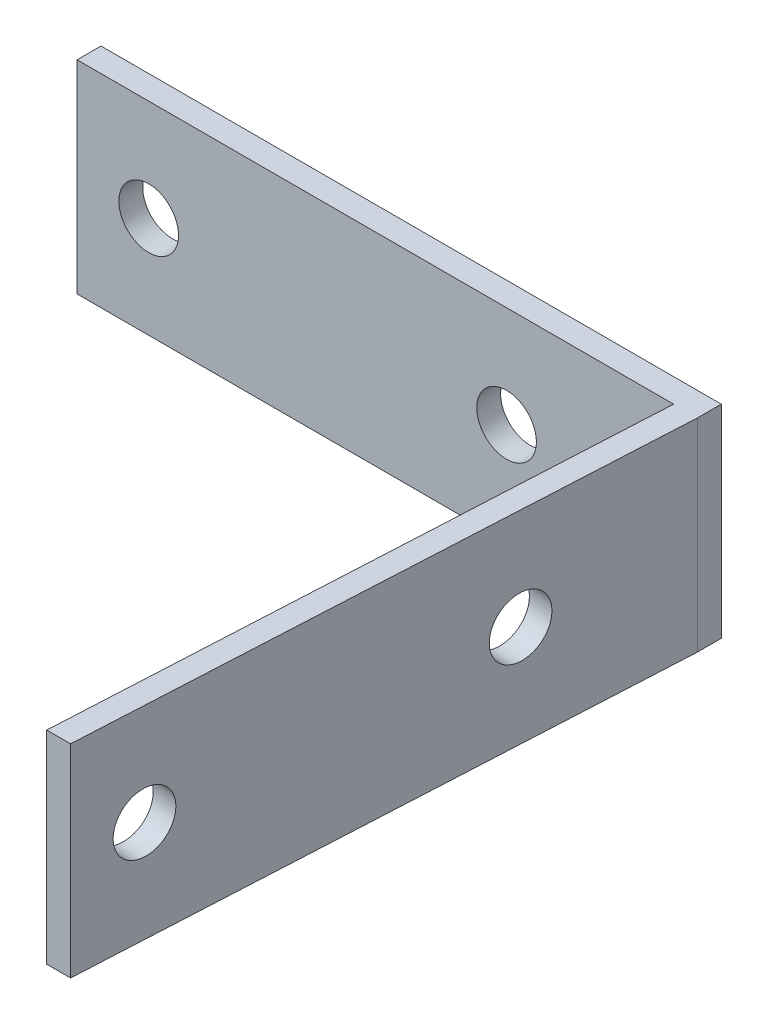
ISO-10303-21;
HEADER;
FILE_DESCRIPTION(('STEP AP214'),'2;1');
FILE_NAME('part.step','',(''),(''),'','','');
FILE_SCHEMA(('AUTOMOTIVE_DESIGN { 1 0 10303 214 1 1 1 1 }'));
ENDSEC;
DATA;
#1=APPLICATION_CONTEXT('core data for automotive mechanical design processes');
#2=APPLICATION_PROTOCOL_DEFINITION('international standard','automotive_design',2000,#1);
#3=PRODUCT_CONTEXT('',#1,'mechanical');
#4=PRODUCT('Part','Part','',(#3));
#5=PRODUCT_RELATED_PRODUCT_CATEGORY('part','',(#4));
#6=PRODUCT_DEFINITION_FORMATION('','',#4);
#7=PRODUCT_DEFINITION_CONTEXT('part definition',#1,'design');
#8=PRODUCT_DEFINITION('design','',#6,#7);
#9=PRODUCT_DEFINITION_SHAPE('','',#8);
#10=(LENGTH_UNIT() NAMED_UNIT(*) SI_UNIT(.MILLI.,.METRE.));
#11=(NAMED_UNIT(*) PLANE_ANGLE_UNIT() SI_UNIT($,.RADIAN.));
#12=(NAMED_UNIT(*) SI_UNIT($,.STERADIAN.) SOLID_ANGLE_UNIT());
#13=UNCERTAINTY_MEASURE_WITH_UNIT(LENGTH_MEASURE(1.E-05),#10,'distance_accuracy_value','');
#14=(GEOMETRIC_REPRESENTATION_CONTEXT(3) GLOBAL_UNCERTAINTY_ASSIGNED_CONTEXT((#13)) GLOBAL_UNIT_ASSIGNED_CONTEXT((#10,
#11,#12)) REPRESENTATION_CONTEXT('',''));
#15=CARTESIAN_POINT('',(0.,0.,0.));
#16=DIRECTION('',(0.,0.,1.));
#17=DIRECTION('',(1.,0.,0.));
#18=AXIS2_PLACEMENT_3D('',#15,#16,#17);
#19=CARTESIAN_POINT('',(26.,8.5,2.));
#20=DIRECTION('',(-1.,0.,0.));
#21=DIRECTION('',(0.,0.,1.));
#22=AXIS2_PLACEMENT_3D('',#19,#20,#21);
#23=PLANE('',#22);
#24=DIRECTION('',(0.,1.,0.));
#25=VECTOR('',#24,1.);
#26=CARTESIAN_POINT('',(26.,8.5,0.));
#27=LINE('',#26,#25);
#28=CARTESIAN_POINT('',(26.,-8.5,0.));
#29=VERTEX_POINT('',#28);
#30=CARTESIAN_POINT('',(26.,8.5,0.));
#31=VERTEX_POINT('',#30);
#32=EDGE_CURVE('E120',#29,#31,#27,.T.);
#33=ORIENTED_EDGE('',*,*,#32,.T.);
#34=DIRECTION('',(0.,0.,-1.));
#35=VECTOR('',#34,1.);
#36=CARTESIAN_POINT('',(26.,8.5,2.));
#37=LINE('',#36,#35);
#38=CARTESIAN_POINT('',(26.,8.5,2.));
#39=VERTEX_POINT('',#38);
#40=EDGE_CURVE('E11',#39,#31,#37,.T.);
#41=ORIENTED_EDGE('',*,*,#40,.F.);
#42=DIRECTION('',(0.,1.,0.));
#43=VECTOR('',#42,1.);
#44=CARTESIAN_POINT('',(26.,8.5,2.));
#45=LINE('',#44,#43);
#46=CARTESIAN_POINT('',(26.,-8.5,2.));
#47=VERTEX_POINT('',#46);
#48=EDGE_CURVE('E119',#47,#39,#45,.T.);
#49=ORIENTED_EDGE('',*,*,#48,.F.);
#50=DIRECTION('',(0.,0.,-1.));
#51=VECTOR('',#50,1.);
#52=CARTESIAN_POINT('',(26.,-8.5,2.));
#53=LINE('',#52,#51);
#54=EDGE_CURVE('E57',#47,#29,#53,.T.);
#55=ORIENTED_EDGE('',*,*,#54,.T.);
#56=EDGE_LOOP('',(#33,#41,#49,#55));
#57=FACE_BOUND('',#56,.T.);
#58=ADVANCED_FACE('F32',(#57),#23,.F.);
#59=CARTESIAN_POINT('',(-26.,8.5,2.));
#60=DIRECTION('',(0.,-1.,0.));
#61=DIRECTION('',(0.,0.,-1.));
#62=AXIS2_PLACEMENT_3D('',#59,#60,#61);
#63=PLANE('',#62);
#64=DIRECTION('',(-1.,0.,0.));
#65=VECTOR('',#64,1.);
#66=CARTESIAN_POINT('',(-26.,8.5,0.));
#67=LINE('',#66,#65);
#68=CARTESIAN_POINT('',(-26.,8.5,0.));
#69=VERTEX_POINT('',#68);
#70=EDGE_CURVE('E122',#31,#69,#67,.T.);
#71=ORIENTED_EDGE('',*,*,#70,.T.);
#72=DIRECTION('',(0.,0.,-1.));
#73=VECTOR('',#72,1.);
#74=CARTESIAN_POINT('',(-26.,8.5,2.));
#75=LINE('',#74,#73);
#76=CARTESIAN_POINT('',(-26.,8.5,2.));
#77=VERTEX_POINT('',#76);
#78=EDGE_CURVE('E40',#77,#69,#75,.T.);
#79=ORIENTED_EDGE('',*,*,#78,.F.);
#80=DIRECTION('',(-1.,0.,0.));
#81=VECTOR('',#80,1.);
#82=CARTESIAN_POINT('',(-26.,8.5,2.));
#83=LINE('',#82,#81);
#84=CARTESIAN_POINT('',(24.,8.5,2.));
#85=VERTEX_POINT('',#84);
#86=EDGE_CURVE('E129',#85,#77,#83,.T.);
#87=ORIENTED_EDGE('',*,*,#86,.F.);
#88=DIRECTION('',(0.0523359562429371,0.,-0.998629534754574));
#89=VECTOR('',#88,1.);
#90=CARTESIAN_POINT('',(21.3832021878531,8.5,51.9314767377287));
#91=LINE('',#90,#89);
#92=CARTESIAN_POINT('',(21.3832021878531,8.5,51.9314767377287));
#93=VERTEX_POINT('',#92);
#94=EDGE_CURVE('E105',#93,#85,#91,.T.);
#95=ORIENTED_EDGE('',*,*,#94,.F.);
#96=DIRECTION('',(-1.,0.,0.));
#97=VECTOR('',#96,1.);
#98=CARTESIAN_POINT('',(23.3832021878531,8.5,51.9314767377287));
#99=LINE('',#98,#97);
#100=CARTESIAN_POINT('',(23.3832021878531,8.5,51.9314767377287));
#101=VERTEX_POINT('',#100);
#102=EDGE_CURVE('E98',#101,#93,#99,.T.);
#103=ORIENTED_EDGE('',*,*,#102,.F.);
#104=DIRECTION('',(0.0523359562429371,0.,-0.998629534754574));
#105=VECTOR('',#104,1.);
#106=CARTESIAN_POINT('',(23.3832021878531,8.5,51.9314767377287));
#107=LINE('',#106,#105);
#108=EDGE_CURVE('E102',#101,#39,#107,.T.);
#109=ORIENTED_EDGE('',*,*,#108,.T.);
#110=ORIENTED_EDGE('',*,*,#40,.T.);
#111=EDGE_LOOP('',(#71,#79,#87,#95,#103,#109,#110));
#112=FACE_BOUND('',#111,.T.);
#113=ADVANCED_FACE('F100',(#112),#63,.F.);
#114=CARTESIAN_POINT('',(-26.,8.5,2.));
#115=DIRECTION('',(1.,0.,0.));
#116=DIRECTION('',(0.,1.,0.));
#117=AXIS2_PLACEMENT_3D('',#114,#115,#116);
#118=PLANE('',#117);
#119=DIRECTION('',(0.,-1.,0.));
#120=VECTOR('',#119,1.);
#121=CARTESIAN_POINT('',(-26.,8.5,0.));
#122=LINE('',#121,#120);
#123=CARTESIAN_POINT('',(-26.,-8.5,0.));
#124=VERTEX_POINT('',#123);
#125=EDGE_CURVE('E136',#69,#124,#122,.T.);
#126=ORIENTED_EDGE('',*,*,#125,.T.);
#127=DIRECTION('',(0.,0.,-1.));
#128=VECTOR('',#127,1.);
#129=CARTESIAN_POINT('',(-26.,-8.5,2.));
#130=LINE('',#129,#128);
#131=CARTESIAN_POINT('',(-26.,-8.5,2.));
#132=VERTEX_POINT('',#131);
#133=EDGE_CURVE('E140',#132,#124,#130,.T.);
#134=ORIENTED_EDGE('',*,*,#133,.F.);
#135=DIRECTION('',(0.,-1.,0.));
#136=VECTOR('',#135,1.);
#137=CARTESIAN_POINT('',(-26.,8.5,2.));
#138=LINE('',#137,#136);
#139=EDGE_CURVE('E131',#77,#132,#138,.T.);
#140=ORIENTED_EDGE('',*,*,#139,.F.);
#141=ORIENTED_EDGE('',*,*,#78,.T.);
#142=EDGE_LOOP('',(#126,#134,#140,#141));
#143=FACE_BOUND('',#142,.T.);
#144=ADVANCED_FACE('F185',(#143),#118,.F.);
#145=CARTESIAN_POINT('',(-26.,-8.5,2.));
#146=DIRECTION('',(0.,1.,0.));
#147=DIRECTION('',(0.,0.,1.));
#148=AXIS2_PLACEMENT_3D('',#145,#146,#147);
#149=PLANE('',#148);
#150=DIRECTION('',(1.,0.,0.));
#151=VECTOR('',#150,1.);
#152=CARTESIAN_POINT('',(-26.,-8.5,0.));
#153=LINE('',#152,#151);
#154=EDGE_CURVE('E77',#124,#29,#153,.T.);
#155=ORIENTED_EDGE('',*,*,#154,.T.);
#156=ORIENTED_EDGE('',*,*,#54,.F.);
#157=DIRECTION('',(0.0523359562429371,0.,-0.998629534754574));
#158=VECTOR('',#157,1.);
#159=CARTESIAN_POINT('',(23.3832021878531,-8.5,51.9314767377287));
#160=LINE('',#159,#158);
#161=CARTESIAN_POINT('',(23.3832021878531,-8.5,51.9314767377287));
#162=VERTEX_POINT('',#161);
#163=EDGE_CURVE('E159',#162,#47,#160,.T.);
#164=ORIENTED_EDGE('',*,*,#163,.F.);
#165=DIRECTION('',(1.,0.,0.));
#166=VECTOR('',#165,1.);
#167=CARTESIAN_POINT('',(23.3832021878531,-8.5,51.9314767377287));
#168=LINE('',#167,#166);
#169=CARTESIAN_POINT('',(21.3832021878531,-8.5,51.9314767377287));
#170=VERTEX_POINT('',#169);
#171=EDGE_CURVE('E114',#170,#162,#168,.T.);
#172=ORIENTED_EDGE('',*,*,#171,.F.);
#173=DIRECTION('',(0.0523359562429371,0.,-0.998629534754574));
#174=VECTOR('',#173,1.);
#175=CARTESIAN_POINT('',(21.3832021878531,-8.5,51.9314767377287));
#176=LINE('',#175,#174);
#177=CARTESIAN_POINT('',(24.,-8.5,2.));
#178=VERTEX_POINT('',#177);
#179=EDGE_CURVE('E124',#170,#178,#176,.T.);
#180=ORIENTED_EDGE('',*,*,#179,.T.);
#181=DIRECTION('',(1.,0.,0.));
#182=VECTOR('',#181,1.);
#183=CARTESIAN_POINT('',(-26.,-8.5,2.));
#184=LINE('',#183,#182);
#185=EDGE_CURVE('E133',#132,#178,#184,.T.);
#186=ORIENTED_EDGE('',*,*,#185,.F.);
#187=ORIENTED_EDGE('',*,*,#133,.T.);
#188=EDGE_LOOP('',(#155,#156,#164,#172,#180,#186,#187));
#189=FACE_BOUND('',#188,.T.);
#190=ADVANCED_FACE('F164',(#189),#149,.F.);
#191=CARTESIAN_POINT('',(0.,0.,2.));
#192=DIRECTION('',(0.,0.,1.));
#193=DIRECTION('',(1.,0.,0.));
#194=AXIS2_PLACEMENT_3D('',#191,#192,#193);
#195=PLANE('',#194);
#196=CARTESIAN_POINT('',(9.99999999999999,0.,2.));
#197=DIRECTION('',(0.,0.,1.));
#198=DIRECTION('',(1.,0.,0.));
#199=AXIS2_PLACEMENT_3D('',#196,#197,#198);
#200=CIRCLE('',#199,2.5);
#201=CARTESIAN_POINT('',(12.5,0.,2.));
#202=VERTEX_POINT('',#201);
#203=EDGE_CURVE('E154',#202,#202,#200,.T.);
#204=ORIENTED_EDGE('',*,*,#203,.F.);
#205=EDGE_LOOP('',(#204));
#206=FACE_BOUND('',#205,.T.);
#207=CARTESIAN_POINT('',(-20.,0.,2.));
#208=DIRECTION('',(0.,0.,1.));
#209=DIRECTION('',(1.,0.,0.));
#210=AXIS2_PLACEMENT_3D('',#207,#208,#209);
#211=CIRCLE('',#210,2.5);
#212=CARTESIAN_POINT('',(-17.5,0.,2.));
#213=VERTEX_POINT('',#212);
#214=EDGE_CURVE('E145',#213,#213,#211,.T.);
#215=ORIENTED_EDGE('',*,*,#214,.F.);
#216=EDGE_LOOP('',(#215));
#217=FACE_BOUND('',#216,.T.);
#218=DIRECTION('',(0.,-1.,0.));
#219=VECTOR('',#218,1.);
#220=CARTESIAN_POINT('',(24.,8.5,2.));
#221=LINE('',#220,#219);
#222=EDGE_CURVE('E48',#85,#178,#221,.T.);
#223=ORIENTED_EDGE('',*,*,#222,.F.);
#224=ORIENTED_EDGE('',*,*,#86,.T.);
#225=ORIENTED_EDGE('',*,*,#139,.T.);
#226=ORIENTED_EDGE('',*,*,#185,.T.);
#227=EDGE_LOOP('',(#223,#224,#225,#226));
#228=FACE_BOUND('',#227,.T.);
#229=ADVANCED_FACE('F193',(#206,#217,#228),#195,.T.);
#230=CARTESIAN_POINT('',(0.,0.,0.));
#231=DIRECTION('',(0.,0.,1.));
#232=DIRECTION('',(1.,0.,0.));
#233=AXIS2_PLACEMENT_3D('',#230,#231,#232);
#234=PLANE('',#233);
#235=CARTESIAN_POINT('',(9.99999999999999,0.,0.));
#236=DIRECTION('',(0.,0.,1.));
#237=DIRECTION('',(1.,0.,0.));
#238=AXIS2_PLACEMENT_3D('',#235,#236,#237);
#239=CIRCLE('',#238,2.5);
#240=CARTESIAN_POINT('',(12.5,0.,0.));
#241=VERTEX_POINT('',#240);
#242=EDGE_CURVE('E35',#241,#241,#239,.T.);
#243=ORIENTED_EDGE('',*,*,#242,.T.);
#244=EDGE_LOOP('',(#243));
#245=FACE_BOUND('',#244,.T.);
#246=CARTESIAN_POINT('',(-20.,0.,0.));
#247=DIRECTION('',(0.,0.,1.));
#248=DIRECTION('',(1.,0.,0.));
#249=AXIS2_PLACEMENT_3D('',#246,#247,#248);
#250=CIRCLE('',#249,2.5);
#251=CARTESIAN_POINT('',(-17.5,0.,0.));
#252=VERTEX_POINT('',#251);
#253=EDGE_CURVE('E143',#252,#252,#250,.T.);
#254=ORIENTED_EDGE('',*,*,#253,.T.);
#255=EDGE_LOOP('',(#254));
#256=FACE_BOUND('',#255,.T.);
#257=ORIENTED_EDGE('',*,*,#32,.F.);
#258=ORIENTED_EDGE('',*,*,#154,.F.);
#259=ORIENTED_EDGE('',*,*,#125,.F.);
#260=ORIENTED_EDGE('',*,*,#70,.F.);
#261=EDGE_LOOP('',(#257,#258,#259,#260));
#262=FACE_BOUND('',#261,.T.);
#263=ADVANCED_FACE('F176',(#245,#256,#262),#234,.F.);
#264=CARTESIAN_POINT('',(23.3832021878531,8.5,51.9314767377287));
#265=DIRECTION('',(-0.998629534754574,0.,-0.0523359562429371));
#266=DIRECTION('',(-0.0523359562429371,0.,0.998629534754574));
#267=AXIS2_PLACEMENT_3D('',#264,#265,#266);
#268=PLANE('',#267);
#269=CARTESIAN_POINT('',(25.2618185079671,0.,16.0853419498317));
#270=DIRECTION('',(-0.998629534754574,0.,-0.0523359562429371));
#271=DIRECTION('',(-0.0523359562429371,0.,0.998629534754574));
#272=AXIS2_PLACEMENT_3D('',#269,#270,#271);
#273=CIRCLE('',#272,2.5);
#274=CARTESIAN_POINT('',(25.1309786173598,0.,18.5819157867181));
#275=VERTEX_POINT('',#274);
#276=EDGE_CURVE('E292',#275,#275,#273,.T.);
#277=ORIENTED_EDGE('',*,*,#276,.T.);
#278=EDGE_LOOP('',(#277));
#279=FACE_BOUND('',#278,.T.);
#280=CARTESIAN_POINT('',(23.691739820679,0.,46.0442279924689));
#281=DIRECTION('',(-0.998629534754574,0.,-0.0523359562429371));
#282=DIRECTION('',(-0.0523359562429371,0.,0.998629534754574));
#283=AXIS2_PLACEMENT_3D('',#280,#281,#282);
#284=CIRCLE('',#283,2.5);
#285=CARTESIAN_POINT('',(23.5608999300717,0.,48.5408018293554));
#286=VERTEX_POINT('',#285);
#287=EDGE_CURVE('E296',#286,#286,#284,.T.);
#288=ORIENTED_EDGE('',*,*,#287,.T.);
#289=EDGE_LOOP('',(#288));
#290=FACE_BOUND('',#289,.T.);
#291=ORIENTED_EDGE('',*,*,#48,.T.);
#292=ORIENTED_EDGE('',*,*,#108,.F.);
#293=DIRECTION('',(0.,1.,0.));
#294=VECTOR('',#293,1.);
#295=CARTESIAN_POINT('',(23.3832021878531,8.5,51.9314767377287));
#296=LINE('',#295,#294);
#297=EDGE_CURVE('E109',#162,#101,#296,.T.);
#298=ORIENTED_EDGE('',*,*,#297,.F.);
#299=ORIENTED_EDGE('',*,*,#163,.T.);
#300=EDGE_LOOP('',(#291,#292,#298,#299));
#301=FACE_BOUND('',#300,.T.);
#302=ADVANCED_FACE('F118',(#279,#290,#301),#268,.F.);
#303=CARTESIAN_POINT('',(21.3832021878531,8.5,51.9314767377287));
#304=DIRECTION('',(0.998629534754574,0.,0.0523359562429371));
#305=DIRECTION('',(0.0523359562429371,0.,-0.998629534754574));
#306=AXIS2_PLACEMENT_3D('',#303,#304,#305);
#307=PLANE('',#306);
#308=CARTESIAN_POINT('',(23.2672966125989,0.,15.980813486564));
#309=DIRECTION('',(-0.998629534754574,0.,-0.0523359562429371));
#310=DIRECTION('',(-0.0523359562429371,0.,0.998629534754574));
#311=AXIS2_PLACEMENT_3D('',#308,#309,#310);
#312=CIRCLE('',#311,2.5);
#313=CARTESIAN_POINT('',(23.1364567219915,0.,18.4773873234505));
#314=VERTEX_POINT('',#313);
#315=EDGE_CURVE('E289',#314,#314,#312,.T.);
#316=ORIENTED_EDGE('',*,*,#315,.F.);
#317=EDGE_LOOP('',(#316));
#318=FACE_BOUND('',#317,.T.);
#319=CARTESIAN_POINT('',(21.6972179253108,0.,45.9396995292013));
#320=DIRECTION('',(-0.998629534754574,0.,-0.0523359562429371));
#321=DIRECTION('',(-0.0523359562429371,0.,0.998629534754574));
#322=AXIS2_PLACEMENT_3D('',#319,#320,#321);
#323=CIRCLE('',#322,2.5);
#324=CARTESIAN_POINT('',(21.5663780347034,0.,48.4362733660877));
#325=VERTEX_POINT('',#324);
#326=EDGE_CURVE('E293',#325,#325,#323,.T.);
#327=ORIENTED_EDGE('',*,*,#326,.F.);
#328=EDGE_LOOP('',(#327));
#329=FACE_BOUND('',#328,.T.);
#330=ORIENTED_EDGE('',*,*,#222,.T.);
#331=ORIENTED_EDGE('',*,*,#179,.F.);
#332=DIRECTION('',(0.,-1.,0.));
#333=VECTOR('',#332,1.);
#334=CARTESIAN_POINT('',(21.3832021878531,8.5,51.9314767377287));
#335=LINE('',#334,#333);
#336=EDGE_CURVE('E108',#93,#170,#335,.T.);
#337=ORIENTED_EDGE('',*,*,#336,.F.);
#338=ORIENTED_EDGE('',*,*,#94,.T.);
#339=EDGE_LOOP('',(#330,#331,#337,#338));
#340=FACE_BOUND('',#339,.T.);
#341=ADVANCED_FACE('F166',(#318,#329,#340),#307,.F.);
#342=CARTESIAN_POINT('',(-2.61679781214686,0.,51.9314767377287));
#343=DIRECTION('',(0.,0.,-1.));
#344=DIRECTION('',(-1.,0.,0.));
#345=AXIS2_PLACEMENT_3D('',#342,#343,#344);
#346=PLANE('',#345);
#347=ORIENTED_EDGE('',*,*,#297,.T.);
#348=ORIENTED_EDGE('',*,*,#102,.T.);
#349=ORIENTED_EDGE('',*,*,#336,.T.);
#350=ORIENTED_EDGE('',*,*,#171,.T.);
#351=EDGE_LOOP('',(#347,#348,#349,#350));
#352=FACE_BOUND('',#351,.T.);
#353=ADVANCED_FACE('F112',(#352),#346,.F.);
#354=CARTESIAN_POINT('',(-20.,0.,-48.));
#355=DIRECTION('',(0.,0.,1.));
#356=DIRECTION('',(1.,0.,0.));
#357=AXIS2_PLACEMENT_3D('',#354,#355,#356);
#358=CYLINDRICAL_SURFACE('',#357,2.5);
#359=ORIENTED_EDGE('',*,*,#214,.T.);
#360=EDGE_LOOP('',(#359));
#361=FACE_BOUND('',#360,.T.);
#362=ORIENTED_EDGE('',*,*,#253,.F.);
#363=EDGE_LOOP('',(#362));
#364=FACE_BOUND('',#363,.T.);
#365=ADVANCED_FACE('F174',(#361,#364),#358,.F.);
#366=CARTESIAN_POINT('',(9.99999999999999,0.,-48.));
#367=DIRECTION('',(0.,0.,1.));
#368=DIRECTION('',(1.,0.,0.));
#369=AXIS2_PLACEMENT_3D('',#366,#367,#368);
#370=CYLINDRICAL_SURFACE('',#369,2.5);
#371=ORIENTED_EDGE('',*,*,#203,.T.);
#372=EDGE_LOOP('',(#371));
#373=FACE_BOUND('',#372,.T.);
#374=ORIENTED_EDGE('',*,*,#242,.F.);
#375=EDGE_LOOP('',(#374));
#376=FACE_BOUND('',#375,.T.);
#377=ADVANCED_FACE('F246',(#373,#376),#370,.F.);
#378=CARTESIAN_POINT('',(71.6286946630395,0.,48.5564973413481));
#379=DIRECTION('',(-0.998629534754574,0.,-0.0523359562429371));
#380=DIRECTION('',(-0.0523359562429371,0.,0.998629534754574));
#381=AXIS2_PLACEMENT_3D('',#378,#379,#380);
#382=CYLINDRICAL_SURFACE('',#381,2.5);
#383=ORIENTED_EDGE('',*,*,#326,.T.);
#384=EDGE_LOOP('',(#383));
#385=FACE_BOUND('',#384,.T.);
#386=ORIENTED_EDGE('',*,*,#287,.F.);
#387=EDGE_LOOP('',(#386));
#388=FACE_BOUND('',#387,.T.);
#389=ADVANCED_FACE('F255',(#385,#388),#382,.F.);
#390=CARTESIAN_POINT('',(73.1987733503276,0.,18.5976112987109));
#391=DIRECTION('',(-0.998629534754574,0.,-0.0523359562429371));
#392=DIRECTION('',(-0.0523359562429371,0.,0.998629534754574));
#393=AXIS2_PLACEMENT_3D('',#390,#391,#392);
#394=CYLINDRICAL_SURFACE('',#393,2.5);
#395=ORIENTED_EDGE('',*,*,#315,.T.);
#396=EDGE_LOOP('',(#395));
#397=FACE_BOUND('',#396,.T.);
#398=ORIENTED_EDGE('',*,*,#276,.F.);
#399=EDGE_LOOP('',(#398));
#400=FACE_BOUND('',#399,.T.);
#401=ADVANCED_FACE('F273',(#397,#400),#394,.F.);
#402=CLOSED_SHELL('',(#58,#113,#144,#190,#229,#263,#302,#341,#353,#365,#377,#389,#401));
#403=MANIFOLD_SOLID_BREP('B2',#402);
#404=ADVANCED_BREP_SHAPE_REPRESENTATION('',(#18,#403),#14);
#405=SHAPE_DEFINITION_REPRESENTATION(#9,#404);
ENDSEC;
END-ISO-10303-21;
